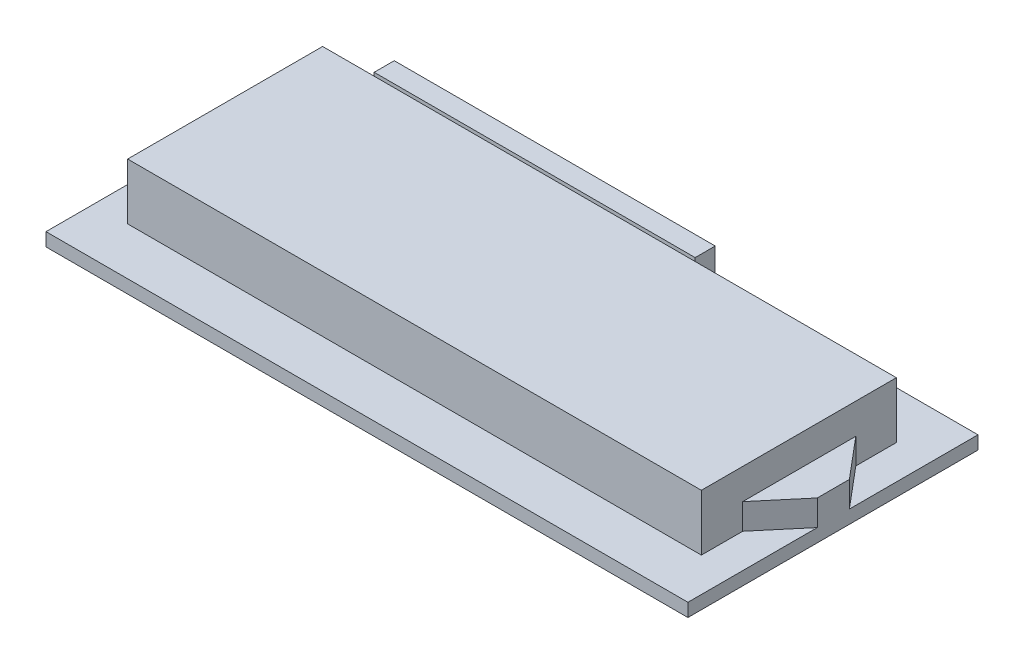
ISO-10303-21;
HEADER;
FILE_DESCRIPTION(('STEP AP214'),'2;1');
FILE_NAME('part.step','',(''),(''),'','','');
FILE_SCHEMA(('AUTOMOTIVE_DESIGN { 1 0 10303 214 1 1 1 1 }'));
ENDSEC;
DATA;
#1=APPLICATION_CONTEXT('core data for automotive mechanical design processes');
#2=APPLICATION_PROTOCOL_DEFINITION('international standard','automotive_design',2000,#1);
#3=PRODUCT_CONTEXT('',#1,'mechanical');
#4=PRODUCT('Part','Part','',(#3));
#5=PRODUCT_RELATED_PRODUCT_CATEGORY('part','',(#4));
#6=PRODUCT_DEFINITION_FORMATION('','',#4);
#7=PRODUCT_DEFINITION_CONTEXT('part definition',#1,'design');
#8=PRODUCT_DEFINITION('design','',#6,#7);
#9=PRODUCT_DEFINITION_SHAPE('','',#8);
#10=(LENGTH_UNIT() NAMED_UNIT(*) SI_UNIT(.MILLI.,.METRE.));
#11=(NAMED_UNIT(*) PLANE_ANGLE_UNIT() SI_UNIT($,.RADIAN.));
#12=(NAMED_UNIT(*) SI_UNIT($,.STERADIAN.) SOLID_ANGLE_UNIT());
#13=UNCERTAINTY_MEASURE_WITH_UNIT(LENGTH_MEASURE(1.E-05),#10,'distance_accuracy_value','');
#14=(GEOMETRIC_REPRESENTATION_CONTEXT(3) GLOBAL_UNCERTAINTY_ASSIGNED_CONTEXT((#13)) GLOBAL_UNIT_ASSIGNED_CONTEXT((#10,
#11,#12)) REPRESENTATION_CONTEXT('',''));
#15=CARTESIAN_POINT('',(0.,0.,0.));
#16=DIRECTION('',(0.,0.,1.));
#17=DIRECTION('',(1.,0.,0.));
#18=AXIS2_PLACEMENT_3D('',#15,#16,#17);
#19=CARTESIAN_POINT('',(47.25,-12.75,0.));
#20=DIRECTION('',(-1.,0.,0.));
#21=DIRECTION('',(0.,0.,1.));
#22=AXIS2_PLACEMENT_3D('',#19,#20,#21);
#23=PLANE('',#22);
#24=DIRECTION('',(0.,1.,0.));
#25=VECTOR('',#24,1.);
#26=CARTESIAN_POINT('',(47.25,-12.75,-28.975));
#27=LINE('',#26,#25);
#28=CARTESIAN_POINT('',(47.25,-12.75,-28.975));
#29=VERTEX_POINT('',#28);
#30=CARTESIAN_POINT('',(47.25,-10.25,-28.975));
#31=VERTEX_POINT('',#30);
#32=EDGE_CURVE('E422',#29,#31,#27,.T.);
#33=ORIENTED_EDGE('',*,*,#32,.F.);
#34=DIRECTION('',(0.,0.,1.));
#35=VECTOR('',#34,1.);
#36=CARTESIAN_POINT('',(47.25,-12.75,0.));
#37=LINE('',#36,#35);
#38=CARTESIAN_POINT('',(47.25,-12.75,-36.15));
#39=VERTEX_POINT('',#38);
#40=EDGE_CURVE('E224',#39,#29,#37,.T.);
#41=ORIENTED_EDGE('',*,*,#40,.F.);
#42=DIRECTION('',(0.,1.,0.));
#43=VECTOR('',#42,1.);
#44=CARTESIAN_POINT('',(47.25,-12.75,-36.15));
#45=LINE('',#44,#43);
#46=CARTESIAN_POINT('',(47.25,-1.65,-36.15));
#47=VERTEX_POINT('',#46);
#48=EDGE_CURVE('E251',#39,#47,#45,.T.);
#49=ORIENTED_EDGE('',*,*,#48,.T.);
#50=DIRECTION('',(0.,0.,1.));
#51=VECTOR('',#50,1.);
#52=CARTESIAN_POINT('',(47.25,-1.65,0.));
#53=LINE('',#52,#51);
#54=CARTESIAN_POINT('',(47.25,-1.65,-17.));
#55=VERTEX_POINT('',#54);
#56=EDGE_CURVE('E226',#47,#55,#53,.T.);
#57=ORIENTED_EDGE('',*,*,#56,.T.);
#58=DIRECTION('',(0.,1.,0.));
#59=VECTOR('',#58,1.);
#60=CARTESIAN_POINT('',(47.25,-12.75,-17.));
#61=LINE('',#60,#59);
#62=CARTESIAN_POINT('',(47.25,-12.75,-17.));
#63=VERTEX_POINT('',#62);
#64=EDGE_CURVE('E248',#63,#55,#61,.T.);
#65=ORIENTED_EDGE('',*,*,#64,.F.);
#66=CARTESIAN_POINT('',(47.25,-12.75,-24.175));
#67=VERTEX_POINT('',#66);
#68=EDGE_CURVE('E238',#67,#63,#37,.T.);
#69=ORIENTED_EDGE('',*,*,#68,.F.);
#70=DIRECTION('',(0.,-1.,0.));
#71=VECTOR('',#70,1.);
#72=CARTESIAN_POINT('',(47.25,-10.25,-24.175));
#73=LINE('',#72,#71);
#74=CARTESIAN_POINT('',(47.25,-10.25,-24.175));
#75=VERTEX_POINT('',#74);
#76=EDGE_CURVE('E218',#75,#67,#73,.T.);
#77=ORIENTED_EDGE('',*,*,#76,.F.);
#78=DIRECTION('',(0.,0.,1.));
#79=VECTOR('',#78,1.);
#80=CARTESIAN_POINT('',(47.25,-10.25,-28.975));
#81=LINE('',#80,#79);
#82=EDGE_CURVE('E424',#31,#75,#81,.T.);
#83=ORIENTED_EDGE('',*,*,#82,.F.);
#84=EDGE_LOOP('',(#33,#41,#49,#57,#65,#69,#77,#83));
#85=FACE_BOUND('',#84,.T.);
#86=ADVANCED_FACE('F40',(#85),#23,.F.);
#87=CARTESIAN_POINT('',(0.,-1.65,0.));
#88=DIRECTION('',(0.,-1.,0.));
#89=DIRECTION('',(0.,0.,-1.));
#90=AXIS2_PLACEMENT_3D('',#87,#88,#89);
#91=PLANE('',#90);
#92=DIRECTION('',(-1.,0.,0.));
#93=VECTOR('',#92,1.);
#94=CARTESIAN_POINT('',(0.,-1.65,-36.15));
#95=LINE('',#94,#93);
#96=CARTESIAN_POINT('',(7.25,-1.65,-36.15));
#97=VERTEX_POINT('',#96);
#98=CARTESIAN_POINT('',(0.,-1.65,-36.15));
#99=VERTEX_POINT('',#98);
#100=EDGE_CURVE('E355',#97,#99,#95,.T.);
#101=ORIENTED_EDGE('',*,*,#100,.F.);
#102=DIRECTION('',(0.,0.,1.));
#103=VECTOR('',#102,1.);
#104=CARTESIAN_POINT('',(7.25,-1.65,0.));
#105=LINE('',#104,#103);
#106=CARTESIAN_POINT('',(7.25,-1.65,-17.));
#107=VERTEX_POINT('',#106);
#108=EDGE_CURVE('E65',#97,#107,#105,.T.);
#109=ORIENTED_EDGE('',*,*,#108,.T.);
#110=DIRECTION('',(-1.,0.,0.));
#111=VECTOR('',#110,1.);
#112=CARTESIAN_POINT('',(0.,-1.65,-17.));
#113=LINE('',#112,#111);
#114=EDGE_CURVE('E236',#55,#107,#113,.T.);
#115=ORIENTED_EDGE('',*,*,#114,.F.);
#116=ORIENTED_EDGE('',*,*,#56,.F.);
#117=CARTESIAN_POINT('',(80.,-1.65,-36.15));
#118=VERTEX_POINT('',#117);
#119=EDGE_CURVE('E356',#118,#47,#95,.T.);
#120=ORIENTED_EDGE('',*,*,#119,.F.);
#121=DIRECTION('',(0.,0.,-1.));
#122=VECTOR('',#121,1.);
#123=CARTESIAN_POINT('',(80.,-1.65,-16.1207486290955));
#124=LINE('',#123,#122);
#125=CARTESIAN_POINT('',(80.,-1.65,0.));
#126=VERTEX_POINT('',#125);
#127=EDGE_CURVE('E352',#126,#118,#124,.T.);
#128=ORIENTED_EDGE('',*,*,#127,.F.);
#129=DIRECTION('',(1.,0.,0.));
#130=VECTOR('',#129,1.);
#131=CARTESIAN_POINT('',(0.,-1.65,0.));
#132=LINE('',#131,#130);
#133=CARTESIAN_POINT('',(0.,-1.65,0.));
#134=VERTEX_POINT('',#133);
#135=EDGE_CURVE('E349',#134,#126,#132,.T.);
#136=ORIENTED_EDGE('',*,*,#135,.F.);
#137=DIRECTION('',(0.,0.,1.));
#138=VECTOR('',#137,1.);
#139=CARTESIAN_POINT('',(0.,-1.65,0.));
#140=LINE('',#139,#138);
#141=EDGE_CURVE('E359',#99,#134,#140,.T.);
#142=ORIENTED_EDGE('',*,*,#141,.F.);
#143=EDGE_LOOP('',(#101,#109,#115,#116,#120,#128,#136,#142));
#144=FACE_BOUND('',#143,.T.);
#145=ADVANCED_FACE('F392',(#144),#91,.T.);
#146=CARTESIAN_POINT('',(0.,0.,0.));
#147=DIRECTION('',(0.,-1.,0.));
#148=DIRECTION('',(0.,0.,-1.));
#149=AXIS2_PLACEMENT_3D('',#146,#147,#148);
#150=PLANE('',#149);
#151=DIRECTION('',(0.,0.,1.));
#152=VECTOR('',#151,1.);
#153=CARTESIAN_POINT('',(7.25,0.,-36.15));
#154=LINE('',#153,#152);
#155=CARTESIAN_POINT('',(7.25,0.,-36.15));
#156=VERTEX_POINT('',#155);
#157=CARTESIAN_POINT('',(7.25,0.,-33.65));
#158=VERTEX_POINT('',#157);
#159=EDGE_CURVE('E257',#156,#158,#154,.T.);
#160=ORIENTED_EDGE('',*,*,#159,.F.);
#161=DIRECTION('',(-1.,0.,0.));
#162=VECTOR('',#161,1.);
#163=CARTESIAN_POINT('',(0.,0.,-36.15));
#164=LINE('',#163,#162);
#165=CARTESIAN_POINT('',(0.,0.,-36.15));
#166=VERTEX_POINT('',#165);
#167=EDGE_CURVE('E367',#156,#166,#164,.T.);
#168=ORIENTED_EDGE('',*,*,#167,.T.);
#169=DIRECTION('',(0.,0.,1.));
#170=VECTOR('',#169,1.);
#171=CARTESIAN_POINT('',(0.,0.,0.));
#172=LINE('',#171,#170);
#173=CARTESIAN_POINT('',(0.,0.,0.));
#174=VERTEX_POINT('',#173);
#175=EDGE_CURVE('E353',#166,#174,#172,.T.);
#176=ORIENTED_EDGE('',*,*,#175,.T.);
#177=DIRECTION('',(1.,0.,0.));
#178=VECTOR('',#177,1.);
#179=CARTESIAN_POINT('',(0.,0.,0.));
#180=LINE('',#179,#178);
#181=CARTESIAN_POINT('',(80.,0.,0.));
#182=VERTEX_POINT('',#181);
#183=EDGE_CURVE('E348',#174,#182,#180,.T.);
#184=ORIENTED_EDGE('',*,*,#183,.T.);
#185=DIRECTION('',(0.,0.,-1.));
#186=VECTOR('',#185,1.);
#187=CARTESIAN_POINT('',(80.,0.,-36.15));
#188=LINE('',#187,#186);
#189=CARTESIAN_POINT('',(80.,0.,-16.1207486290955));
#190=VERTEX_POINT('',#189);
#191=EDGE_CURVE('E365',#182,#190,#188,.T.);
#192=ORIENTED_EDGE('',*,*,#191,.T.);
#193=DIRECTION('',(0.643902440084728,0.,-0.765107605277149));
#194=VECTOR('',#193,1.);
#195=CARTESIAN_POINT('',(80.,0.,-16.1207486290955));
#196=LINE('',#195,#194);
#197=CARTESIAN_POINT('',(75.75,0.,-11.0707486290955));
#198=VERTEX_POINT('',#197);
#199=EDGE_CURVE('E292',#198,#190,#196,.T.);
#200=ORIENTED_EDGE('',*,*,#199,.F.);
#201=DIRECTION('',(0.,0.,-1.));
#202=VECTOR('',#201,1.);
#203=CARTESIAN_POINT('',(75.75,0.,-11.0707486290955));
#204=LINE('',#203,#202);
#205=CARTESIAN_POINT('',(75.75,0.,-5.925));
#206=VERTEX_POINT('',#205);
#207=EDGE_CURVE('E318',#206,#198,#204,.T.);
#208=ORIENTED_EDGE('',*,*,#207,.F.);
#209=DIRECTION('',(1.,0.,0.));
#210=VECTOR('',#209,1.);
#211=CARTESIAN_POINT('',(4.25,0.,-5.925));
#212=LINE('',#211,#210);
#213=CARTESIAN_POINT('',(4.25,0.,-5.925));
#214=VERTEX_POINT('',#213);
#215=EDGE_CURVE('E331',#214,#206,#212,.T.);
#216=ORIENTED_EDGE('',*,*,#215,.F.);
#217=DIRECTION('',(0.,0.,1.));
#218=VECTOR('',#217,1.);
#219=CARTESIAN_POINT('',(4.25,0.,-5.925));
#220=LINE('',#219,#218);
#221=CARTESIAN_POINT('',(4.25,0.,-30.225));
#222=VERTEX_POINT('',#221);
#223=EDGE_CURVE('E328',#222,#214,#220,.T.);
#224=ORIENTED_EDGE('',*,*,#223,.F.);
#225=DIRECTION('',(-1.,0.,0.));
#226=VECTOR('',#225,1.);
#227=CARTESIAN_POINT('',(4.25,0.,-30.225));
#228=LINE('',#227,#226);
#229=CARTESIAN_POINT('',(75.75,0.,-30.225));
#230=VERTEX_POINT('',#229);
#231=EDGE_CURVE('E314',#230,#222,#228,.T.);
#232=ORIENTED_EDGE('',*,*,#231,.F.);
#233=CARTESIAN_POINT('',(75.75,0.,-25.1707486290955));
#234=VERTEX_POINT('',#233);
#235=EDGE_CURVE('E334',#234,#230,#204,.T.);
#236=ORIENTED_EDGE('',*,*,#235,.F.);
#237=DIRECTION('',(-0.643902440084728,0.,-0.765107605277149));
#238=VECTOR('',#237,1.);
#239=CARTESIAN_POINT('',(75.75,0.,-25.1707486290955));
#240=LINE('',#239,#238);
#241=CARTESIAN_POINT('',(80.,0.,-20.1207486290955));
#242=VERTEX_POINT('',#241);
#243=EDGE_CURVE('E287',#242,#234,#240,.T.);
#244=ORIENTED_EDGE('',*,*,#243,.F.);
#245=CARTESIAN_POINT('',(80.,0.,-36.15));
#246=VERTEX_POINT('',#245);
#247=EDGE_CURVE('E364',#242,#246,#188,.T.);
#248=ORIENTED_EDGE('',*,*,#247,.T.);
#249=CARTESIAN_POINT('',(47.25,0.,-36.15));
#250=VERTEX_POINT('',#249);
#251=EDGE_CURVE('E368',#246,#250,#164,.T.);
#252=ORIENTED_EDGE('',*,*,#251,.T.);
#253=DIRECTION('',(0.,0.,-1.));
#254=VECTOR('',#253,1.);
#255=CARTESIAN_POINT('',(47.25,0.,-36.15));
#256=LINE('',#255,#254);
#257=CARTESIAN_POINT('',(47.25,0.,-33.65));
#258=VERTEX_POINT('',#257);
#259=EDGE_CURVE('E262',#258,#250,#256,.T.);
#260=ORIENTED_EDGE('',*,*,#259,.F.);
#261=DIRECTION('',(1.,0.,0.));
#262=VECTOR('',#261,1.);
#263=CARTESIAN_POINT('',(7.25,0.,-33.65));
#264=LINE('',#263,#262);
#265=EDGE_CURVE('E271',#158,#258,#264,.T.);
#266=ORIENTED_EDGE('',*,*,#265,.F.);
#267=EDGE_LOOP('',(#160,#168,#176,#184,#192,#200,#208,#216,#224,#232,#236,#244,#248,#252,#260,#266));
#268=FACE_BOUND('',#267,.T.);
#269=ADVANCED_FACE('F386',(#268),#150,.F.);
#270=CARTESIAN_POINT('',(75.75,7.,-11.0707486290955));
#271=DIRECTION('',(-1.,0.,0.));
#272=DIRECTION('',(0.,0.,1.));
#273=AXIS2_PLACEMENT_3D('',#270,#271,#272);
#274=PLANE('',#273);
#275=DIRECTION('',(0.,-1.,0.));
#276=VECTOR('',#275,1.);
#277=CARTESIAN_POINT('',(75.75,3.2,-25.1707486290955));
#278=LINE('',#277,#276);
#279=CARTESIAN_POINT('',(75.75,3.2,-25.1707486290955));
#280=VERTEX_POINT('',#279);
#281=EDGE_CURVE('E312',#280,#234,#278,.T.);
#282=ORIENTED_EDGE('',*,*,#281,.T.);
#283=ORIENTED_EDGE('',*,*,#235,.T.);
#284=DIRECTION('',(0.,-1.,0.));
#285=VECTOR('',#284,1.);
#286=CARTESIAN_POINT('',(75.75,7.,-30.225));
#287=LINE('',#286,#285);
#288=CARTESIAN_POINT('',(75.75,7.,-30.225));
#289=VERTEX_POINT('',#288);
#290=EDGE_CURVE('E345',#289,#230,#287,.T.);
#291=ORIENTED_EDGE('',*,*,#290,.F.);
#292=DIRECTION('',(0.,0.,-1.));
#293=VECTOR('',#292,1.);
#294=CARTESIAN_POINT('',(75.75,7.,-25.1707486290955));
#295=LINE('',#294,#293);
#296=CARTESIAN_POINT('',(75.75,7.,-5.925));
#297=VERTEX_POINT('',#296);
#298=EDGE_CURVE('E315',#297,#289,#295,.T.);
#299=ORIENTED_EDGE('',*,*,#298,.F.);
#300=DIRECTION('',(0.,-1.,0.));
#301=VECTOR('',#300,1.);
#302=CARTESIAN_POINT('',(75.75,7.,-5.925));
#303=LINE('',#302,#301);
#304=EDGE_CURVE('E325',#297,#206,#303,.T.);
#305=ORIENTED_EDGE('',*,*,#304,.T.);
#306=ORIENTED_EDGE('',*,*,#207,.T.);
#307=DIRECTION('',(0.,-1.,0.));
#308=VECTOR('',#307,1.);
#309=CARTESIAN_POINT('',(75.75,3.2,-11.0707486290955));
#310=LINE('',#309,#308);
#311=CARTESIAN_POINT('',(75.75,3.2,-11.0707486290955));
#312=VERTEX_POINT('',#311);
#313=EDGE_CURVE('E309',#312,#198,#310,.T.);
#314=ORIENTED_EDGE('',*,*,#313,.F.);
#315=DIRECTION('',(0.,0.,1.));
#316=VECTOR('',#315,1.);
#317=CARTESIAN_POINT('',(75.75,3.2,-25.1707486290955));
#318=LINE('',#317,#316);
#319=EDGE_CURVE('E291',#280,#312,#318,.T.);
#320=ORIENTED_EDGE('',*,*,#319,.F.);
#321=EDGE_LOOP('',(#282,#283,#291,#299,#305,#306,#314,#320));
#322=FACE_BOUND('',#321,.T.);
#323=ADVANCED_FACE('F483',(#322),#274,.F.);
#324=CARTESIAN_POINT('',(0.,-1.65,0.));
#325=DIRECTION('',(0.,0.,1.));
#326=DIRECTION('',(1.,0.,0.));
#327=AXIS2_PLACEMENT_3D('',#324,#325,#326);
#328=PLANE('',#327);
#329=ORIENTED_EDGE('',*,*,#183,.F.);
#330=DIRECTION('',(0.,1.,0.));
#331=VECTOR('',#330,1.);
#332=CARTESIAN_POINT('',(0.,-1.65,0.));
#333=LINE('',#332,#331);
#334=EDGE_CURVE('E11',#134,#174,#333,.T.);
#335=ORIENTED_EDGE('',*,*,#334,.F.);
#336=ORIENTED_EDGE('',*,*,#135,.T.);
#337=DIRECTION('',(0.,1.,0.));
#338=VECTOR('',#337,1.);
#339=CARTESIAN_POINT('',(80.,-1.65,0.));
#340=LINE('',#339,#338);
#341=EDGE_CURVE('E44',#126,#182,#340,.T.);
#342=ORIENTED_EDGE('',*,*,#341,.T.);
#343=EDGE_LOOP('',(#329,#335,#336,#342));
#344=FACE_BOUND('',#343,.T.);
#345=ADVANCED_FACE('F42',(#344),#328,.T.);
#346=CARTESIAN_POINT('',(0.,-1.65,0.));
#347=DIRECTION('',(-1.,0.,0.));
#348=DIRECTION('',(0.,0.,1.));
#349=AXIS2_PLACEMENT_3D('',#346,#347,#348);
#350=PLANE('',#349);
#351=ORIENTED_EDGE('',*,*,#175,.F.);
#352=DIRECTION('',(0.,1.,0.));
#353=VECTOR('',#352,1.);
#354=CARTESIAN_POINT('',(0.,-1.65,-36.15));
#355=LINE('',#354,#353);
#356=EDGE_CURVE('E49',#99,#166,#355,.T.);
#357=ORIENTED_EDGE('',*,*,#356,.F.);
#358=ORIENTED_EDGE('',*,*,#141,.T.);
#359=ORIENTED_EDGE('',*,*,#334,.T.);
#360=EDGE_LOOP('',(#351,#357,#358,#359));
#361=FACE_BOUND('',#360,.T.);
#362=ADVANCED_FACE('F390',(#361),#350,.T.);
#363=CARTESIAN_POINT('',(0.,-1.65,-36.15));
#364=DIRECTION('',(0.,0.,-1.));
#365=DIRECTION('',(-1.,0.,0.));
#366=AXIS2_PLACEMENT_3D('',#363,#364,#365);
#367=PLANE('',#366);
#368=ORIENTED_EDGE('',*,*,#251,.F.);
#369=DIRECTION('',(0.,1.,0.));
#370=VECTOR('',#369,1.);
#371=CARTESIAN_POINT('',(80.,-1.65,-36.15));
#372=LINE('',#371,#370);
#373=EDGE_CURVE('E373',#118,#246,#372,.T.);
#374=ORIENTED_EDGE('',*,*,#373,.F.);
#375=ORIENTED_EDGE('',*,*,#119,.T.);
#376=ORIENTED_EDGE('',*,*,#48,.F.);
#377=DIRECTION('',(1.,0.,0.));
#378=VECTOR('',#377,1.);
#379=CARTESIAN_POINT('',(0.,-12.75,-36.15));
#380=LINE('',#379,#378);
#381=CARTESIAN_POINT('',(7.25,-12.75,-36.15));
#382=VERTEX_POINT('',#381);
#383=EDGE_CURVE('E235',#382,#39,#380,.T.);
#384=ORIENTED_EDGE('',*,*,#383,.F.);
#385=DIRECTION('',(0.,1.,0.));
#386=VECTOR('',#385,1.);
#387=CARTESIAN_POINT('',(7.25,-12.75,-36.15));
#388=LINE('',#387,#386);
#389=EDGE_CURVE('E254',#382,#97,#388,.T.);
#390=ORIENTED_EDGE('',*,*,#389,.T.);
#391=ORIENTED_EDGE('',*,*,#100,.T.);
#392=ORIENTED_EDGE('',*,*,#356,.T.);
#393=ORIENTED_EDGE('',*,*,#167,.F.);
#394=DIRECTION('',(0.,-1.,0.));
#395=VECTOR('',#394,1.);
#396=CARTESIAN_POINT('',(7.25,4.,-36.15));
#397=LINE('',#396,#395);
#398=CARTESIAN_POINT('',(7.25,4.,-36.15));
#399=VERTEX_POINT('',#398);
#400=EDGE_CURVE('E268',#399,#156,#397,.T.);
#401=ORIENTED_EDGE('',*,*,#400,.F.);
#402=DIRECTION('',(-1.,0.,0.));
#403=VECTOR('',#402,1.);
#404=CARTESIAN_POINT('',(7.25,4.,-36.15));
#405=LINE('',#404,#403);
#406=CARTESIAN_POINT('',(47.25,4.,-36.15));
#407=VERTEX_POINT('',#406);
#408=EDGE_CURVE('E266',#407,#399,#405,.T.);
#409=ORIENTED_EDGE('',*,*,#408,.F.);
#410=DIRECTION('',(0.,-1.,0.));
#411=VECTOR('',#410,1.);
#412=CARTESIAN_POINT('',(47.25,4.,-36.15));
#413=LINE('',#412,#411);
#414=EDGE_CURVE('E278',#407,#250,#413,.T.);
#415=ORIENTED_EDGE('',*,*,#414,.T.);
#416=EDGE_LOOP('',(#368,#374,#375,#376,#384,#390,#391,#392,#393,#401,#409,#415));
#417=FACE_BOUND('',#416,.T.);
#418=ADVANCED_FACE('F396',(#417),#367,.T.);
#419=CARTESIAN_POINT('',(80.,-1.65,-36.15));
#420=DIRECTION('',(1.,0.,0.));
#421=DIRECTION('',(0.,0.,-1.));
#422=AXIS2_PLACEMENT_3D('',#419,#420,#421);
#423=PLANE('',#422);
#424=ORIENTED_EDGE('',*,*,#191,.F.);
#425=ORIENTED_EDGE('',*,*,#341,.F.);
#426=ORIENTED_EDGE('',*,*,#127,.T.);
#427=ORIENTED_EDGE('',*,*,#373,.T.);
#428=ORIENTED_EDGE('',*,*,#247,.F.);
#429=DIRECTION('',(0.,-1.,0.));
#430=VECTOR('',#429,1.);
#431=CARTESIAN_POINT('',(80.,3.2,-20.1207486290955));
#432=LINE('',#431,#430);
#433=CARTESIAN_POINT('',(80.,3.2,-20.1207486290955));
#434=VERTEX_POINT('',#433);
#435=EDGE_CURVE('E299',#434,#242,#432,.T.);
#436=ORIENTED_EDGE('',*,*,#435,.F.);
#437=DIRECTION('',(0.,0.,-1.));
#438=VECTOR('',#437,1.);
#439=CARTESIAN_POINT('',(80.,3.2,-20.1207486290955));
#440=LINE('',#439,#438);
#441=CARTESIAN_POINT('',(80.,3.2,-16.1207486290955));
#442=VERTEX_POINT('',#441);
#443=EDGE_CURVE('E297',#442,#434,#440,.T.);
#444=ORIENTED_EDGE('',*,*,#443,.F.);
#445=DIRECTION('',(0.,-1.,0.));
#446=VECTOR('',#445,1.);
#447=CARTESIAN_POINT('',(80.,3.2,-16.1207486290955));
#448=LINE('',#447,#446);
#449=EDGE_CURVE('E306',#442,#190,#448,.T.);
#450=ORIENTED_EDGE('',*,*,#449,.T.);
#451=EDGE_LOOP('',(#424,#425,#426,#427,#428,#436,#444,#450));
#452=FACE_BOUND('',#451,.T.);
#453=ADVANCED_FACE('F394',(#452),#423,.T.);
#454=CARTESIAN_POINT('',(4.25,7.,-30.225));
#455=DIRECTION('',(0.,0.,1.));
#456=DIRECTION('',(1.,0.,0.));
#457=AXIS2_PLACEMENT_3D('',#454,#455,#456);
#458=PLANE('',#457);
#459=ORIENTED_EDGE('',*,*,#231,.T.);
#460=DIRECTION('',(0.,-1.,0.));
#461=VECTOR('',#460,1.);
#462=CARTESIAN_POINT('',(4.25,7.,-30.225));
#463=LINE('',#462,#461);
#464=CARTESIAN_POINT('',(4.25,7.,-30.225));
#465=VERTEX_POINT('',#464);
#466=EDGE_CURVE('E342',#465,#222,#463,.T.);
#467=ORIENTED_EDGE('',*,*,#466,.F.);
#468=DIRECTION('',(-1.,0.,0.));
#469=VECTOR('',#468,1.);
#470=CARTESIAN_POINT('',(4.25,7.,-30.225));
#471=LINE('',#470,#469);
#472=EDGE_CURVE('E317',#289,#465,#471,.T.);
#473=ORIENTED_EDGE('',*,*,#472,.F.);
#474=ORIENTED_EDGE('',*,*,#290,.T.);
#475=EDGE_LOOP('',(#459,#467,#473,#474));
#476=FACE_BOUND('',#475,.T.);
#477=ADVANCED_FACE('F493',(#476),#458,.F.);
#478=CARTESIAN_POINT('',(4.25,7.,-5.925));
#479=DIRECTION('',(1.,0.,0.));
#480=DIRECTION('',(0.,0.,-1.));
#481=AXIS2_PLACEMENT_3D('',#478,#479,#480);
#482=PLANE('',#481);
#483=ORIENTED_EDGE('',*,*,#223,.T.);
#484=DIRECTION('',(0.,-1.,0.));
#485=VECTOR('',#484,1.);
#486=CARTESIAN_POINT('',(4.25,7.,-5.925));
#487=LINE('',#486,#485);
#488=CARTESIAN_POINT('',(4.25,7.,-5.925));
#489=VERTEX_POINT('',#488);
#490=EDGE_CURVE('E339',#489,#214,#487,.T.);
#491=ORIENTED_EDGE('',*,*,#490,.F.);
#492=DIRECTION('',(0.,0.,1.));
#493=VECTOR('',#492,1.);
#494=CARTESIAN_POINT('',(4.25,7.,-5.925));
#495=LINE('',#494,#493);
#496=EDGE_CURVE('E320',#465,#489,#495,.T.);
#497=ORIENTED_EDGE('',*,*,#496,.F.);
#498=ORIENTED_EDGE('',*,*,#466,.T.);
#499=EDGE_LOOP('',(#483,#491,#497,#498));
#500=FACE_BOUND('',#499,.T.);
#501=ADVANCED_FACE('F489',(#500),#482,.F.);
#502=CARTESIAN_POINT('',(4.25,7.,-5.925));
#503=DIRECTION('',(0.,0.,-1.));
#504=DIRECTION('',(-1.,0.,0.));
#505=AXIS2_PLACEMENT_3D('',#502,#503,#504);
#506=PLANE('',#505);
#507=ORIENTED_EDGE('',*,*,#215,.T.);
#508=ORIENTED_EDGE('',*,*,#304,.F.);
#509=DIRECTION('',(1.,0.,0.));
#510=VECTOR('',#509,1.);
#511=CARTESIAN_POINT('',(4.25,7.,-5.925));
#512=LINE('',#511,#510);
#513=EDGE_CURVE('E322',#489,#297,#512,.T.);
#514=ORIENTED_EDGE('',*,*,#513,.F.);
#515=ORIENTED_EDGE('',*,*,#490,.T.);
#516=EDGE_LOOP('',(#507,#508,#514,#515));
#517=FACE_BOUND('',#516,.T.);
#518=ADVANCED_FACE('F481',(#517),#506,.F.);
#519=CARTESIAN_POINT('',(0.,7.,0.));
#520=DIRECTION('',(0.,1.,0.));
#521=DIRECTION('',(0.,0.,1.));
#522=AXIS2_PLACEMENT_3D('',#519,#520,#521);
#523=PLANE('',#522);
#524=ORIENTED_EDGE('',*,*,#298,.T.);
#525=ORIENTED_EDGE('',*,*,#472,.T.);
#526=ORIENTED_EDGE('',*,*,#496,.T.);
#527=ORIENTED_EDGE('',*,*,#513,.T.);
#528=EDGE_LOOP('',(#524,#525,#526,#527));
#529=FACE_BOUND('',#528,.T.);
#530=ADVANCED_FACE('F477',(#529),#523,.T.);
#531=CARTESIAN_POINT('',(75.75,3.2,-25.1707486290955));
#532=DIRECTION('',(-0.765107605277149,0.,0.643902440084728));
#533=DIRECTION('',(0.643902440084728,0.,0.765107605277149));
#534=AXIS2_PLACEMENT_3D('',#531,#532,#533);
#535=PLANE('',#534);
#536=ORIENTED_EDGE('',*,*,#243,.T.);
#537=ORIENTED_EDGE('',*,*,#281,.F.);
#538=DIRECTION('',(-0.643902440084728,0.,-0.765107605277149));
#539=VECTOR('',#538,1.);
#540=CARTESIAN_POINT('',(75.75,3.2,-25.1707486290955));
#541=LINE('',#540,#539);
#542=EDGE_CURVE('E288',#434,#280,#541,.T.);
#543=ORIENTED_EDGE('',*,*,#542,.F.);
#544=ORIENTED_EDGE('',*,*,#435,.T.);
#545=EDGE_LOOP('',(#536,#537,#543,#544));
#546=FACE_BOUND('',#545,.T.);
#547=ADVANCED_FACE('F473',(#546),#535,.F.);
#548=CARTESIAN_POINT('',(80.,3.2,-16.1207486290955));
#549=DIRECTION('',(-0.765107605277149,0.,-0.643902440084728));
#550=DIRECTION('',(-0.643902440084728,0.,0.765107605277149));
#551=AXIS2_PLACEMENT_3D('',#548,#549,#550);
#552=PLANE('',#551);
#553=ORIENTED_EDGE('',*,*,#199,.T.);
#554=ORIENTED_EDGE('',*,*,#449,.F.);
#555=DIRECTION('',(0.643902440084728,0.,-0.765107605277149));
#556=VECTOR('',#555,1.);
#557=CARTESIAN_POINT('',(80.,3.2,-16.1207486290955));
#558=LINE('',#557,#556);
#559=EDGE_CURVE('E295',#312,#442,#558,.T.);
#560=ORIENTED_EDGE('',*,*,#559,.F.);
#561=ORIENTED_EDGE('',*,*,#313,.T.);
#562=EDGE_LOOP('',(#553,#554,#560,#561));
#563=FACE_BOUND('',#562,.T.);
#564=ADVANCED_FACE('F469',(#563),#552,.F.);
#565=CARTESIAN_POINT('',(0.,3.2,0.));
#566=DIRECTION('',(0.,-1.,0.));
#567=DIRECTION('',(0.,0.,-1.));
#568=AXIS2_PLACEMENT_3D('',#565,#566,#567);
#569=PLANE('',#568);
#570=ORIENTED_EDGE('',*,*,#542,.T.);
#571=ORIENTED_EDGE('',*,*,#319,.T.);
#572=ORIENTED_EDGE('',*,*,#559,.T.);
#573=ORIENTED_EDGE('',*,*,#443,.T.);
#574=EDGE_LOOP('',(#570,#571,#572,#573));
#575=FACE_BOUND('',#574,.T.);
#576=ADVANCED_FACE('F466',(#575),#569,.F.);
#577=CARTESIAN_POINT('',(7.25,4.,-36.15));
#578=DIRECTION('',(1.,0.,0.));
#579=DIRECTION('',(0.,0.,-1.));
#580=AXIS2_PLACEMENT_3D('',#577,#578,#579);
#581=PLANE('',#580);
#582=ORIENTED_EDGE('',*,*,#159,.T.);
#583=DIRECTION('',(0.,-1.,0.));
#584=VECTOR('',#583,1.);
#585=CARTESIAN_POINT('',(7.25,4.,-33.65));
#586=LINE('',#585,#584);
#587=CARTESIAN_POINT('',(7.25,4.,-33.65));
#588=VERTEX_POINT('',#587);
#589=EDGE_CURVE('E284',#588,#158,#586,.T.);
#590=ORIENTED_EDGE('',*,*,#589,.F.);
#591=DIRECTION('',(0.,0.,1.));
#592=VECTOR('',#591,1.);
#593=CARTESIAN_POINT('',(7.25,4.,-36.15));
#594=LINE('',#593,#592);
#595=EDGE_CURVE('E258',#399,#588,#594,.T.);
#596=ORIENTED_EDGE('',*,*,#595,.F.);
#597=ORIENTED_EDGE('',*,*,#400,.T.);
#598=EDGE_LOOP('',(#582,#590,#596,#597));
#599=FACE_BOUND('',#598,.T.);
#600=ADVANCED_FACE('F410',(#599),#581,.F.);
#601=CARTESIAN_POINT('',(7.25,4.,-33.65));
#602=DIRECTION('',(0.,0.,-1.));
#603=DIRECTION('',(-1.,0.,0.));
#604=AXIS2_PLACEMENT_3D('',#601,#602,#603);
#605=PLANE('',#604);
#606=ORIENTED_EDGE('',*,*,#265,.T.);
#607=DIRECTION('',(0.,-1.,0.));
#608=VECTOR('',#607,1.);
#609=CARTESIAN_POINT('',(47.25,4.,-33.65));
#610=LINE('',#609,#608);
#611=CARTESIAN_POINT('',(47.25,4.,-33.65));
#612=VERTEX_POINT('',#611);
#613=EDGE_CURVE('E281',#612,#258,#610,.T.);
#614=ORIENTED_EDGE('',*,*,#613,.F.);
#615=DIRECTION('',(1.,0.,0.));
#616=VECTOR('',#615,1.);
#617=CARTESIAN_POINT('',(7.25,4.,-33.65));
#618=LINE('',#617,#616);
#619=EDGE_CURVE('E261',#588,#612,#618,.T.);
#620=ORIENTED_EDGE('',*,*,#619,.F.);
#621=ORIENTED_EDGE('',*,*,#589,.T.);
#622=EDGE_LOOP('',(#606,#614,#620,#621));
#623=FACE_BOUND('',#622,.T.);
#624=ADVANCED_FACE('F405',(#623),#605,.F.);
#625=CARTESIAN_POINT('',(47.25,4.,-36.15));
#626=DIRECTION('',(-1.,0.,0.));
#627=DIRECTION('',(0.,0.,1.));
#628=AXIS2_PLACEMENT_3D('',#625,#626,#627);
#629=PLANE('',#628);
#630=ORIENTED_EDGE('',*,*,#259,.T.);
#631=ORIENTED_EDGE('',*,*,#414,.F.);
#632=DIRECTION('',(0.,0.,-1.));
#633=VECTOR('',#632,1.);
#634=CARTESIAN_POINT('',(47.25,4.,-36.15));
#635=LINE('',#634,#633);
#636=EDGE_CURVE('E264',#612,#407,#635,.T.);
#637=ORIENTED_EDGE('',*,*,#636,.F.);
#638=ORIENTED_EDGE('',*,*,#613,.T.);
#639=EDGE_LOOP('',(#630,#631,#637,#638));
#640=FACE_BOUND('',#639,.T.);
#641=ADVANCED_FACE('F401',(#640),#629,.F.);
#642=CARTESIAN_POINT('',(0.,4.,0.));
#643=DIRECTION('',(0.,1.,0.));
#644=DIRECTION('',(0.,0.,1.));
#645=AXIS2_PLACEMENT_3D('',#642,#643,#644);
#646=PLANE('',#645);
#647=ORIENTED_EDGE('',*,*,#595,.T.);
#648=ORIENTED_EDGE('',*,*,#619,.T.);
#649=ORIENTED_EDGE('',*,*,#636,.T.);
#650=ORIENTED_EDGE('',*,*,#408,.T.);
#651=EDGE_LOOP('',(#647,#648,#649,#650));
#652=FACE_BOUND('',#651,.T.);
#653=ADVANCED_FACE('F456',(#652),#646,.T.);
#654=CARTESIAN_POINT('',(7.25,-12.75,0.));
#655=DIRECTION('',(-1.,0.,0.));
#656=DIRECTION('',(0.,0.,1.));
#657=AXIS2_PLACEMENT_3D('',#654,#655,#656);
#658=PLANE('',#657);
#659=ORIENTED_EDGE('',*,*,#108,.F.);
#660=ORIENTED_EDGE('',*,*,#389,.F.);
#661=DIRECTION('',(0.,0.,1.));
#662=VECTOR('',#661,1.);
#663=CARTESIAN_POINT('',(7.25,-12.75,0.));
#664=LINE('',#663,#662);
#665=CARTESIAN_POINT('',(7.25,-12.75,-17.));
#666=VERTEX_POINT('',#665);
#667=EDGE_CURVE('E232',#382,#666,#664,.T.);
#668=ORIENTED_EDGE('',*,*,#667,.T.);
#669=DIRECTION('',(0.,1.,0.));
#670=VECTOR('',#669,1.);
#671=CARTESIAN_POINT('',(7.25,-12.75,-17.));
#672=LINE('',#671,#670);
#673=EDGE_CURVE('E241',#666,#107,#672,.T.);
#674=ORIENTED_EDGE('',*,*,#673,.T.);
#675=EDGE_LOOP('',(#659,#660,#668,#674));
#676=FACE_BOUND('',#675,.T.);
#677=ADVANCED_FACE('F413',(#676),#658,.T.);
#678=CARTESIAN_POINT('',(0.,-12.75,-17.));
#679=DIRECTION('',(0.,0.,-1.));
#680=DIRECTION('',(-1.,0.,0.));
#681=AXIS2_PLACEMENT_3D('',#678,#679,#680);
#682=PLANE('',#681);
#683=ORIENTED_EDGE('',*,*,#114,.T.);
#684=ORIENTED_EDGE('',*,*,#673,.F.);
#685=DIRECTION('',(-1.,0.,0.));
#686=VECTOR('',#685,1.);
#687=CARTESIAN_POINT('',(0.,-12.75,-17.));
#688=LINE('',#687,#686);
#689=EDGE_CURVE('E240',#63,#666,#688,.T.);
#690=ORIENTED_EDGE('',*,*,#689,.F.);
#691=ORIENTED_EDGE('',*,*,#64,.T.);
#692=EDGE_LOOP('',(#683,#684,#690,#691));
#693=FACE_BOUND('',#692,.T.);
#694=ADVANCED_FACE('F417',(#693),#682,.F.);
#695=CARTESIAN_POINT('',(0.,-12.75,0.));
#696=DIRECTION('',(0.,-1.,0.));
#697=DIRECTION('',(0.,0.,-1.));
#698=AXIS2_PLACEMENT_3D('',#695,#696,#697);
#699=PLANE('',#698);
#700=ORIENTED_EDGE('',*,*,#667,.F.);
#701=ORIENTED_EDGE('',*,*,#383,.T.);
#702=ORIENTED_EDGE('',*,*,#40,.T.);
#703=DIRECTION('',(-1.,0.,0.));
#704=VECTOR('',#703,1.);
#705=CARTESIAN_POINT('',(53.25,-12.75,-28.975));
#706=LINE('',#705,#704);
#707=CARTESIAN_POINT('',(53.25,-12.75,-28.975));
#708=VERTEX_POINT('',#707);
#709=EDGE_CURVE('E206',#708,#29,#706,.T.);
#710=ORIENTED_EDGE('',*,*,#709,.F.);
#711=DIRECTION('',(0.,0.,-1.));
#712=VECTOR('',#711,1.);
#713=CARTESIAN_POINT('',(53.25,-12.75,-24.175));
#714=LINE('',#713,#712);
#715=CARTESIAN_POINT('',(53.25,-12.75,-24.175));
#716=VERTEX_POINT('',#715);
#717=EDGE_CURVE('E213',#716,#708,#714,.T.);
#718=ORIENTED_EDGE('',*,*,#717,.F.);
#719=DIRECTION('',(-1.,0.,0.));
#720=VECTOR('',#719,1.);
#721=CARTESIAN_POINT('',(53.25,-12.75,-24.175));
#722=LINE('',#721,#720);
#723=EDGE_CURVE('E57',#716,#67,#722,.T.);
#724=ORIENTED_EDGE('',*,*,#723,.T.);
#725=ORIENTED_EDGE('',*,*,#68,.T.);
#726=ORIENTED_EDGE('',*,*,#689,.T.);
#727=EDGE_LOOP('',(#700,#701,#702,#710,#718,#724,#725,#726));
#728=FACE_BOUND('',#727,.T.);
#729=ADVANCED_FACE('F222',(#728),#699,.T.);
#730=CARTESIAN_POINT('',(53.25,-12.75,-28.975));
#731=DIRECTION('',(0.,0.,1.));
#732=DIRECTION('',(1.,0.,0.));
#733=AXIS2_PLACEMENT_3D('',#730,#731,#732);
#734=PLANE('',#733);
#735=ORIENTED_EDGE('',*,*,#32,.T.);
#736=DIRECTION('',(-1.,0.,0.));
#737=VECTOR('',#736,1.);
#738=CARTESIAN_POINT('',(53.25,-10.25,-28.975));
#739=LINE('',#738,#737);
#740=CARTESIAN_POINT('',(53.25,-10.25,-28.975));
#741=VERTEX_POINT('',#740);
#742=EDGE_CURVE('E209',#741,#31,#739,.T.);
#743=ORIENTED_EDGE('',*,*,#742,.F.);
#744=DIRECTION('',(0.,1.,0.));
#745=VECTOR('',#744,1.);
#746=CARTESIAN_POINT('',(53.25,-12.75,-28.975));
#747=LINE('',#746,#745);
#748=EDGE_CURVE('E202',#708,#741,#747,.T.);
#749=ORIENTED_EDGE('',*,*,#748,.F.);
#750=ORIENTED_EDGE('',*,*,#709,.T.);
#751=EDGE_LOOP('',(#735,#743,#749,#750));
#752=FACE_BOUND('',#751,.T.);
#753=ADVANCED_FACE('F204',(#752),#734,.F.);
#754=CARTESIAN_POINT('',(53.25,-10.25,-28.975));
#755=DIRECTION('',(0.,-1.,0.));
#756=DIRECTION('',(0.,0.,-1.));
#757=AXIS2_PLACEMENT_3D('',#754,#755,#756);
#758=PLANE('',#757);
#759=ORIENTED_EDGE('',*,*,#82,.T.);
#760=DIRECTION('',(-1.,0.,0.));
#761=VECTOR('',#760,1.);
#762=CARTESIAN_POINT('',(53.25,-10.25,-24.175));
#763=LINE('',#762,#761);
#764=CARTESIAN_POINT('',(53.25,-10.25,-24.175));
#765=VERTEX_POINT('',#764);
#766=EDGE_CURVE('E228',#765,#75,#763,.T.);
#767=ORIENTED_EDGE('',*,*,#766,.F.);
#768=DIRECTION('',(0.,0.,1.));
#769=VECTOR('',#768,1.);
#770=CARTESIAN_POINT('',(53.25,-10.25,-28.975));
#771=LINE('',#770,#769);
#772=EDGE_CURVE('E212',#741,#765,#771,.T.);
#773=ORIENTED_EDGE('',*,*,#772,.F.);
#774=ORIENTED_EDGE('',*,*,#742,.T.);
#775=EDGE_LOOP('',(#759,#767,#773,#774));
#776=FACE_BOUND('',#775,.T.);
#777=ADVANCED_FACE('F436',(#776),#758,.F.);
#778=CARTESIAN_POINT('',(53.25,-10.25,-24.175));
#779=DIRECTION('',(0.,0.,-1.));
#780=DIRECTION('',(-1.,0.,0.));
#781=AXIS2_PLACEMENT_3D('',#778,#779,#780);
#782=PLANE('',#781);
#783=ORIENTED_EDGE('',*,*,#76,.T.);
#784=ORIENTED_EDGE('',*,*,#723,.F.);
#785=DIRECTION('',(0.,-1.,0.));
#786=VECTOR('',#785,1.);
#787=CARTESIAN_POINT('',(53.25,-10.25,-24.175));
#788=LINE('',#787,#786);
#789=EDGE_CURVE('E217',#765,#716,#788,.T.);
#790=ORIENTED_EDGE('',*,*,#789,.F.);
#791=ORIENTED_EDGE('',*,*,#766,.T.);
#792=EDGE_LOOP('',(#783,#784,#790,#791));
#793=FACE_BOUND('',#792,.T.);
#794=ADVANCED_FACE('F434',(#793),#782,.F.);
#795=CARTESIAN_POINT('',(53.25,0.,0.));
#796=DIRECTION('',(1.,0.,0.));
#797=DIRECTION('',(0.,0.,-1.));
#798=AXIS2_PLACEMENT_3D('',#795,#796,#797);
#799=PLANE('',#798);
#800=ORIENTED_EDGE('',*,*,#717,.T.);
#801=ORIENTED_EDGE('',*,*,#748,.T.);
#802=ORIENTED_EDGE('',*,*,#772,.T.);
#803=ORIENTED_EDGE('',*,*,#789,.T.);
#804=EDGE_LOOP('',(#800,#801,#802,#803));
#805=FACE_BOUND('',#804,.T.);
#806=ADVANCED_FACE('F215',(#805),#799,.T.);
#807=CLOSED_SHELL('',(#86,#145,#269,#323,#345,#362,#418,#453,#477,#501,#518,#530,#547,#564,#576,
#600,#624,#641,#653,#677,#694,#729,#753,#777,#794,#806));
#808=MANIFOLD_SOLID_BREP('B2',#807);
#809=ADVANCED_BREP_SHAPE_REPRESENTATION('',(#18,#808),#14);
#810=SHAPE_DEFINITION_REPRESENTATION(#9,#809);
ENDSEC;
END-ISO-10303-21;
